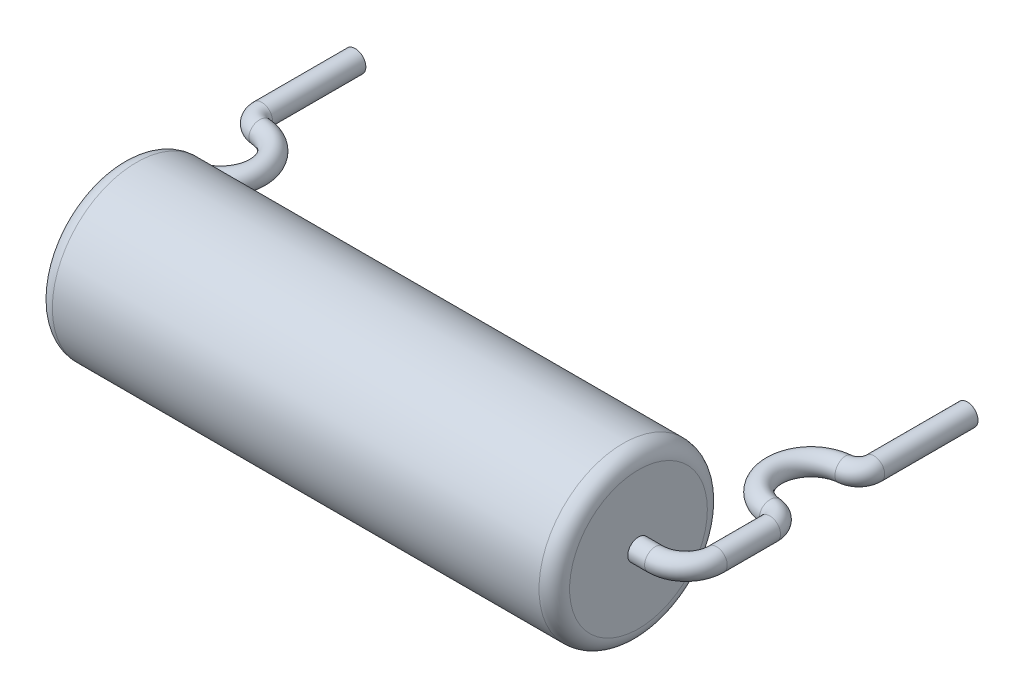
ISO-10303-21;
HEADER;
FILE_DESCRIPTION(('STEP AP214'),'2;1');
FILE_NAME('part.step','',(''),(''),'','','');
FILE_SCHEMA(('AUTOMOTIVE_DESIGN { 1 0 10303 214 1 1 1 1 }'));
ENDSEC;
DATA;
#1=APPLICATION_CONTEXT('core data for automotive mechanical design processes');
#2=APPLICATION_PROTOCOL_DEFINITION('international standard','automotive_design',2000,#1);
#3=PRODUCT_CONTEXT('',#1,'mechanical');
#4=PRODUCT('Part','Part','',(#3));
#5=PRODUCT_RELATED_PRODUCT_CATEGORY('part','',(#4));
#6=PRODUCT_DEFINITION_FORMATION('','',#4);
#7=PRODUCT_DEFINITION_CONTEXT('part definition',#1,'design');
#8=PRODUCT_DEFINITION('design','',#6,#7);
#9=PRODUCT_DEFINITION_SHAPE('','',#8);
#10=(LENGTH_UNIT() NAMED_UNIT(*) SI_UNIT(.MILLI.,.METRE.));
#11=(NAMED_UNIT(*) PLANE_ANGLE_UNIT() SI_UNIT($,.RADIAN.));
#12=(NAMED_UNIT(*) SI_UNIT($,.STERADIAN.) SOLID_ANGLE_UNIT());
#13=UNCERTAINTY_MEASURE_WITH_UNIT(LENGTH_MEASURE(1.E-05),#10,'distance_accuracy_value','');
#14=(GEOMETRIC_REPRESENTATION_CONTEXT(3) GLOBAL_UNCERTAINTY_ASSIGNED_CONTEXT((#13)) GLOBAL_UNIT_ASSIGNED_CONTEXT((#10,
#11,#12)) REPRESENTATION_CONTEXT('',''));
#15=CARTESIAN_POINT('',(0.,0.,0.));
#16=DIRECTION('',(0.,0.,1.));
#17=DIRECTION('',(1.,0.,0.));
#18=AXIS2_PLACEMENT_3D('',#15,#16,#17);
#19=CARTESIAN_POINT('',(55.4043058474384,17.8562,0.710478700154001));
#20=DIRECTION('',(0.,1.,0.));
#21=DIRECTION('',(0.,0.,1.));
#22=AXIS2_PLACEMENT_3D('',#19,#20,#21);
#23=TOROIDAL_SURFACE('',#22,0.635,0.4445);
#24=CARTESIAN_POINT('',(54.7693058474384,17.8562,0.710478700154001));
#25=DIRECTION('',(0.,0.,-1.));
#26=DIRECTION('',(-1.,0.,0.));
#27=AXIS2_PLACEMENT_3D('',#24,#25,#26);
#28=CIRCLE('',#27,0.4445);
#29=CARTESIAN_POINT('',(55.2138058474384,17.8562,0.710478700154001));
#30=VERTEX_POINT('',#29);
#31=EDGE_CURVE('E37',#30,#30,#28,.T.);
#32=ORIENTED_EDGE('',*,*,#31,.F.);
#33=EDGE_LOOP('',(#32));
#34=FACE_BOUND('',#33,.T.);
#35=CARTESIAN_POINT('',(55.3501691719874,17.8562,1.343166791058));
#36=DIRECTION('',(-0.996359198273232,0.,-0.08525460700937));
#37=DIRECTION('',(-0.08525460700937,0.,0.996359198273232));
#38=AXIS2_PLACEMENT_3D('',#35,#36,#37);
#39=CIRCLE('',#38,0.4445);
#40=CARTESIAN_POINT('',(55.3880648448031,17.8562,0.900285127425225));
#41=VERTEX_POINT('',#40);
#42=EDGE_CURVE('E11',#41,#41,#39,.T.);
#43=ORIENTED_EDGE('',*,*,#42,.T.);
#44=EDGE_LOOP('',(#43));
#45=FACE_BOUND('',#44,.T.);
#46=ADVANCED_FACE('F16',(#34,#45),#23,.T.);
#47=CARTESIAN_POINT('',(55.2195068402254,17.8562,2.8702));
#48=DIRECTION('',(0.,-1.,0.));
#49=DIRECTION('',(0.,0.,-1.));
#50=AXIS2_PLACEMENT_3D('',#47,#48,#49);
#51=TOROIDAL_SURFACE('',#50,1.532613149544,0.4445);
#52=ORIENTED_EDGE('',*,*,#42,.F.);
#53=EDGE_LOOP('',(#52));
#54=FACE_BOUND('',#53,.T.);
#55=CARTESIAN_POINT('',(55.3501691719874,17.8562,4.397233208942));
#56=DIRECTION('',(0.996359198273232,0.,-0.08525460700937));
#57=DIRECTION('',(-0.08525460700937,0.,-0.996359198273232));
#58=AXIS2_PLACEMENT_3D('',#55,#56,#57);
#59=CIRCLE('',#58,0.4445);
#60=CARTESIAN_POINT('',(55.3122734991718,17.8562,3.9543515453098));
#61=VERTEX_POINT('',#60);
#62=EDGE_CURVE('E26',#61,#61,#59,.T.);
#63=ORIENTED_EDGE('',*,*,#62,.T.);
#64=EDGE_LOOP('',(#63));
#65=FACE_BOUND('',#64,.T.);
#66=ADVANCED_FACE('F205',(#54,#65),#51,.T.);
#67=CARTESIAN_POINT('',(55.4043058474384,17.8562,5.029921299846));
#68=DIRECTION('',(0.,1.,0.));
#69=DIRECTION('',(0.,0.,1.));
#70=AXIS2_PLACEMENT_3D('',#67,#68,#69);
#71=TOROIDAL_SURFACE('',#70,0.635,0.4445);
#72=ORIENTED_EDGE('',*,*,#62,.F.);
#73=EDGE_LOOP('',(#72));
#74=FACE_BOUND('',#73,.T.);
#75=CARTESIAN_POINT('',(54.7693058474384,17.8562,5.029921299846));
#76=DIRECTION('',(0.,0.,-1.));
#77=DIRECTION('',(-1.,0.,0.));
#78=AXIS2_PLACEMENT_3D('',#75,#76,#77);
#79=CIRCLE('',#78,0.4445);
#80=CARTESIAN_POINT('',(55.2138058474384,17.8562,5.029921299846));
#81=VERTEX_POINT('',#80);
#82=EDGE_CURVE('E132',#81,#81,#79,.T.);
#83=ORIENTED_EDGE('',*,*,#82,.T.);
#84=EDGE_LOOP('',(#83));
#85=FACE_BOUND('',#84,.T.);
#86=ADVANCED_FACE('F210',(#74,#85),#71,.T.);
#87=CARTESIAN_POINT('',(56.0393058474384,17.8562,7.2427));
#88=DIRECTION('',(0.,1.,0.));
#89=DIRECTION('',(0.,0.,1.));
#90=AXIS2_PLACEMENT_3D('',#87,#88,#89);
#91=TOROIDAL_SURFACE('',#90,1.27,0.4445);
#92=CARTESIAN_POINT('',(54.7693058474384,17.8562,7.2427));
#93=DIRECTION('',(0.,0.,-1.));
#94=DIRECTION('',(-1.,0.,0.));
#95=AXIS2_PLACEMENT_3D('',#92,#93,#94);
#96=CIRCLE('',#95,0.4445);
#97=CARTESIAN_POINT('',(55.2138058474384,17.8562,7.2427));
#98=VERTEX_POINT('',#97);
#99=EDGE_CURVE('E123',#98,#98,#96,.T.);
#100=ORIENTED_EDGE('',*,*,#99,.F.);
#101=EDGE_LOOP('',(#100));
#102=FACE_BOUND('',#101,.T.);
#103=CARTESIAN_POINT('',(56.0393058474384,17.8562,8.5127));
#104=DIRECTION('',(-1.,0.,0.));
#105=DIRECTION('',(0.,0.,1.));
#106=AXIS2_PLACEMENT_3D('',#103,#104,#105);
#107=CIRCLE('',#106,0.4445);
#108=CARTESIAN_POINT('',(56.0393058474384,17.8562,8.0682));
#109=VERTEX_POINT('',#108);
#110=EDGE_CURVE('E136',#109,#109,#107,.T.);
#111=ORIENTED_EDGE('',*,*,#110,.T.);
#112=EDGE_LOOP('',(#111));
#113=FACE_BOUND('',#112,.T.);
#114=ADVANCED_FACE('F251',(#102,#113),#91,.T.);
#115=CARTESIAN_POINT('',(78.8993058474384,17.8562,7.2427));
#116=DIRECTION('',(0.,1.,0.));
#117=DIRECTION('',(0.,0.,1.));
#118=AXIS2_PLACEMENT_3D('',#115,#116,#117);
#119=TOROIDAL_SURFACE('',#118,1.27,0.4445);
#120=CARTESIAN_POINT('',(78.8993058474384,17.8562,8.5127));
#121=DIRECTION('',(-1.,0.,0.));
#122=DIRECTION('',(0.,0.,1.));
#123=AXIS2_PLACEMENT_3D('',#120,#121,#122);
#124=CIRCLE('',#123,0.4445);
#125=CARTESIAN_POINT('',(78.8993058474384,17.8562,8.0682));
#126=VERTEX_POINT('',#125);
#127=EDGE_CURVE('E128',#126,#126,#124,.T.);
#128=ORIENTED_EDGE('',*,*,#127,.F.);
#129=EDGE_LOOP('',(#128));
#130=FACE_BOUND('',#129,.T.);
#131=CARTESIAN_POINT('',(80.1693058474384,17.8562,7.2427));
#132=DIRECTION('',(0.,0.,1.));
#133=DIRECTION('',(1.,0.,0.));
#134=AXIS2_PLACEMENT_3D('',#131,#132,#133);
#135=CIRCLE('',#134,0.4445);
#136=CARTESIAN_POINT('',(79.7248058474384,17.8562,7.2427));
#137=VERTEX_POINT('',#136);
#138=EDGE_CURVE('E146',#137,#137,#135,.T.);
#139=ORIENTED_EDGE('',*,*,#138,.T.);
#140=EDGE_LOOP('',(#139));
#141=FACE_BOUND('',#140,.T.);
#142=ADVANCED_FACE('F187',(#130,#141),#119,.T.);
#143=CARTESIAN_POINT('',(79.5343058474384,17.8562,5.029921299846));
#144=DIRECTION('',(0.,1.,0.));
#145=DIRECTION('',(0.,0.,1.));
#146=AXIS2_PLACEMENT_3D('',#143,#144,#145);
#147=TOROIDAL_SURFACE('',#146,0.635,0.4445);
#148=CARTESIAN_POINT('',(80.1693058474384,17.8562,5.029921299846));
#149=DIRECTION('',(0.,0.,1.));
#150=DIRECTION('',(1.,0.,0.));
#151=AXIS2_PLACEMENT_3D('',#148,#149,#150);
#152=CIRCLE('',#151,0.4445);
#153=CARTESIAN_POINT('',(79.7248058474384,17.8562,5.029921299846));
#154=VERTEX_POINT('',#153);
#155=EDGE_CURVE('E157',#154,#154,#152,.T.);
#156=ORIENTED_EDGE('',*,*,#155,.F.);
#157=EDGE_LOOP('',(#156));
#158=FACE_BOUND('',#157,.T.);
#159=CARTESIAN_POINT('',(79.5884425228894,17.8562,4.397233208942));
#160=DIRECTION('',(0.996359198273233,0.,0.0852546070093598));
#161=DIRECTION('',(0.0852546070093598,0.,-0.996359198273233));
#162=AXIS2_PLACEMENT_3D('',#159,#160,#161);
#163=CIRCLE('',#162,0.4445);
#164=CARTESIAN_POINT('',(79.5505468500737,17.8562,4.84011487257478));
#165=VERTEX_POINT('',#164);
#166=EDGE_CURVE('E158',#165,#165,#163,.T.);
#167=ORIENTED_EDGE('',*,*,#166,.T.);
#168=EDGE_LOOP('',(#167));
#169=FACE_BOUND('',#168,.T.);
#170=ADVANCED_FACE('F255',(#158,#169),#147,.T.);
#171=CARTESIAN_POINT('',(79.7191048546514,17.8562,2.8702));
#172=DIRECTION('',(0.,-1.,0.));
#173=DIRECTION('',(0.,0.,-1.));
#174=AXIS2_PLACEMENT_3D('',#171,#172,#173);
#175=TOROIDAL_SURFACE('',#174,1.532613149544,0.4445);
#176=ORIENTED_EDGE('',*,*,#166,.F.);
#177=EDGE_LOOP('',(#176));
#178=FACE_BOUND('',#177,.T.);
#179=CARTESIAN_POINT('',(79.5884425228894,17.8562,1.343166791058));
#180=DIRECTION('',(-0.996359198273233,0.,0.0852546070093598));
#181=DIRECTION('',(0.0852546070093598,0.,0.996359198273233));
#182=AXIS2_PLACEMENT_3D('',#179,#180,#181);
#183=CIRCLE('',#182,0.4445);
#184=CARTESIAN_POINT('',(79.6263381957051,17.8562,1.78604845469021));
#185=VERTEX_POINT('',#184);
#186=EDGE_CURVE('E141',#185,#185,#183,.T.);
#187=ORIENTED_EDGE('',*,*,#186,.T.);
#188=EDGE_LOOP('',(#187));
#189=FACE_BOUND('',#188,.T.);
#190=ADVANCED_FACE('F259',(#178,#189),#175,.T.);
#191=CARTESIAN_POINT('',(79.5343058474384,17.8562,0.710478700154001));
#192=DIRECTION('',(0.,1.,0.));
#193=DIRECTION('',(0.,0.,1.));
#194=AXIS2_PLACEMENT_3D('',#191,#192,#193);
#195=TOROIDAL_SURFACE('',#194,0.635,0.4445);
#196=ORIENTED_EDGE('',*,*,#186,.F.);
#197=EDGE_LOOP('',(#196));
#198=FACE_BOUND('',#197,.T.);
#199=CARTESIAN_POINT('',(80.1693058474384,17.8562,0.710478700154001));
#200=DIRECTION('',(0.,0.,1.));
#201=DIRECTION('',(1.,0.,0.));
#202=AXIS2_PLACEMENT_3D('',#199,#200,#201);
#203=CIRCLE('',#202,0.4445);
#204=CARTESIAN_POINT('',(79.7248058474384,17.8562,0.710478700154001));
#205=VERTEX_POINT('',#204);
#206=EDGE_CURVE('E137',#205,#205,#203,.T.);
#207=ORIENTED_EDGE('',*,*,#206,.T.);
#208=EDGE_LOOP('',(#207));
#209=FACE_BOUND('',#208,.T.);
#210=ADVANCED_FACE('F228',(#198,#209),#195,.T.);
#211=CARTESIAN_POINT('',(80.1693058474384,17.8562,0.0127000000000011));
#212=DIRECTION('',(0.,0.,-1.));
#213=DIRECTION('',(-1.,0.,0.));
#214=AXIS2_PLACEMENT_3D('',#211,#212,#213);
#215=CYLINDRICAL_SURFACE('',#214,0.4445);
#216=ORIENTED_EDGE('',*,*,#206,.F.);
#217=EDGE_LOOP('',(#216));
#218=FACE_BOUND('',#217,.T.);
#219=CARTESIAN_POINT('',(80.1693058474384,17.8562,-3.1623));
#220=DIRECTION('',(0.,0.,1.));
#221=DIRECTION('',(-1.,0.,0.));
#222=AXIS2_PLACEMENT_3D('',#219,#220,#221);
#223=CIRCLE('',#222,0.4445);
#224=CARTESIAN_POINT('',(79.7248058474384,17.8562,-3.1623));
#225=VERTEX_POINT('',#224);
#226=EDGE_CURVE('E142',#225,#225,#223,.T.);
#227=ORIENTED_EDGE('',*,*,#226,.T.);
#228=EDGE_LOOP('',(#227));
#229=FACE_BOUND('',#228,.T.);
#230=ADVANCED_FACE('F221',(#218,#229),#215,.T.);
#231=CARTESIAN_POINT('',(54.7693058474384,17.8562,0.0127000000000011));
#232=DIRECTION('',(0.,0.,-1.));
#233=DIRECTION('',(-1.,0.,0.));
#234=AXIS2_PLACEMENT_3D('',#231,#232,#233);
#235=CYLINDRICAL_SURFACE('',#234,0.4445);
#236=ORIENTED_EDGE('',*,*,#31,.T.);
#237=EDGE_LOOP('',(#236));
#238=FACE_BOUND('',#237,.T.);
#239=CARTESIAN_POINT('',(54.7693058474384,17.8562,-3.1623));
#240=DIRECTION('',(0.,0.,1.));
#241=DIRECTION('',(-1.,0.,0.));
#242=AXIS2_PLACEMENT_3D('',#239,#240,#241);
#243=CIRCLE('',#242,0.4445);
#244=CARTESIAN_POINT('',(54.3248058474384,17.8562,-3.1623));
#245=VERTEX_POINT('',#244);
#246=EDGE_CURVE('E153',#245,#245,#243,.T.);
#247=ORIENTED_EDGE('',*,*,#246,.T.);
#248=EDGE_LOOP('',(#247));
#249=FACE_BOUND('',#248,.T.);
#250=ADVANCED_FACE('F219',(#238,#249),#235,.T.);
#251=CARTESIAN_POINT('',(54.7693058474384,17.8562,5.029921299846));
#252=DIRECTION('',(0.,0.,1.));
#253=DIRECTION('',(-1.,0.,0.));
#254=AXIS2_PLACEMENT_3D('',#251,#252,#253);
#255=CYLINDRICAL_SURFACE('',#254,0.4445);
#256=ORIENTED_EDGE('',*,*,#82,.F.);
#257=EDGE_LOOP('',(#256));
#258=FACE_BOUND('',#257,.T.);
#259=ORIENTED_EDGE('',*,*,#99,.T.);
#260=EDGE_LOOP('',(#259));
#261=FACE_BOUND('',#260,.T.);
#262=ADVANCED_FACE('F199',(#258,#261),#255,.T.);
#263=CARTESIAN_POINT('',(56.0393058474384,17.8562,8.5127));
#264=DIRECTION('',(1.,0.,0.));
#265=DIRECTION('',(0.,0.,1.));
#266=AXIS2_PLACEMENT_3D('',#263,#264,#265);
#267=CYLINDRICAL_SURFACE('',#266,0.4445);
#268=CARTESIAN_POINT('',(78.2008058474384,17.8562,8.5127));
#269=DIRECTION('',(1.,0.,0.));
#270=DIRECTION('',(0.,0.,1.));
#271=AXIS2_PLACEMENT_3D('',#268,#269,#270);
#272=CIRCLE('',#271,0.4445);
#273=CARTESIAN_POINT('',(78.2008058474384,17.8562,8.0682));
#274=VERTEX_POINT('',#273);
#275=EDGE_CURVE('E124',#274,#274,#272,.T.);
#276=ORIENTED_EDGE('',*,*,#275,.T.);
#277=EDGE_LOOP('',(#276));
#278=FACE_BOUND('',#277,.T.);
#279=ORIENTED_EDGE('',*,*,#127,.T.);
#280=EDGE_LOOP('',(#279));
#281=FACE_BOUND('',#280,.T.);
#282=ADVANCED_FACE('F191',(#278,#281),#267,.T.);
#283=CARTESIAN_POINT('',(80.1693058474384,17.8562,7.2427));
#284=DIRECTION('',(0.,0.,-1.));
#285=DIRECTION('',(1.,0.,0.));
#286=AXIS2_PLACEMENT_3D('',#283,#284,#285);
#287=CYLINDRICAL_SURFACE('',#286,0.4445);
#288=ORIENTED_EDGE('',*,*,#138,.F.);
#289=EDGE_LOOP('',(#288));
#290=FACE_BOUND('',#289,.T.);
#291=ORIENTED_EDGE('',*,*,#155,.T.);
#292=EDGE_LOOP('',(#291));
#293=FACE_BOUND('',#292,.T.);
#294=ADVANCED_FACE('F189',(#290,#293),#287,.T.);
#295=CARTESIAN_POINT('',(56.0393058474384,17.8562,8.5127));
#296=DIRECTION('',(1.,0.,0.));
#297=DIRECTION('',(0.,0.,1.));
#298=AXIS2_PLACEMENT_3D('',#295,#296,#297);
#299=CYLINDRICAL_SURFACE('',#298,0.4445);
#300=ORIENTED_EDGE('',*,*,#110,.F.);
#301=EDGE_LOOP('',(#300));
#302=FACE_BOUND('',#301,.T.);
#303=CARTESIAN_POINT('',(56.7378058474384,17.8562,8.5127));
#304=DIRECTION('',(-1.,0.,0.));
#305=DIRECTION('',(0.,0.,1.));
#306=AXIS2_PLACEMENT_3D('',#303,#304,#305);
#307=CIRCLE('',#306,0.4445);
#308=CARTESIAN_POINT('',(56.7378058474384,17.8562,8.9572));
#309=VERTEX_POINT('',#308);
#310=EDGE_CURVE('E150',#309,#309,#307,.T.);
#311=ORIENTED_EDGE('',*,*,#310,.T.);
#312=EDGE_LOOP('',(#311));
#313=FACE_BOUND('',#312,.T.);
#314=ADVANCED_FACE('F18',(#302,#313),#299,.T.);
#315=CARTESIAN_POINT('',(57.3728058474384,17.8562,8.5127));
#316=DIRECTION('',(-1.,0.,0.));
#317=DIRECTION('',(0.,0.,1.));
#318=AXIS2_PLACEMENT_3D('',#315,#316,#317);
#319=TOROIDAL_SURFACE('',#318,2.8575,0.635);
#320=CARTESIAN_POINT('',(57.3728058474384,17.8562,8.5127));
#321=DIRECTION('',(-1.,0.,0.));
#322=DIRECTION('',(0.,0.,1.));
#323=AXIS2_PLACEMENT_3D('',#320,#321,#322);
#324=CIRCLE('',#323,3.4925);
#325=CARTESIAN_POINT('',(57.3728058474384,17.8562,5.0202));
#326=VERTEX_POINT('',#325);
#327=EDGE_CURVE('E117',#326,#326,#324,.T.);
#328=ORIENTED_EDGE('',*,*,#327,.T.);
#329=EDGE_LOOP('',(#328));
#330=FACE_BOUND('',#329,.T.);
#331=CARTESIAN_POINT('',(56.7378058474384,17.8562,8.5127));
#332=DIRECTION('',(-1.,0.,0.));
#333=DIRECTION('',(0.,0.,1.));
#334=AXIS2_PLACEMENT_3D('',#331,#332,#333);
#335=CIRCLE('',#334,2.8575);
#336=CARTESIAN_POINT('',(56.7378058474384,17.8562,11.3702));
#337=VERTEX_POINT('',#336);
#338=EDGE_CURVE('E110',#337,#337,#335,.T.);
#339=ORIENTED_EDGE('',*,*,#338,.F.);
#340=EDGE_LOOP('',(#339));
#341=FACE_BOUND('',#340,.T.);
#342=ADVANCED_FACE('F197',(#330,#341),#319,.T.);
#343=CARTESIAN_POINT('',(67.4693058474384,17.8562,8.5127));
#344=DIRECTION('',(-1.,0.,0.));
#345=DIRECTION('',(0.,0.,1.));
#346=AXIS2_PLACEMENT_3D('',#343,#344,#345);
#347=CYLINDRICAL_SURFACE('',#346,3.4925);
#348=CARTESIAN_POINT('',(77.5658058474384,17.8562,8.5127));
#349=DIRECTION('',(-1.,0.,0.));
#350=DIRECTION('',(0.,0.,1.));
#351=AXIS2_PLACEMENT_3D('',#348,#349,#350);
#352=CIRCLE('',#351,3.4925);
#353=CARTESIAN_POINT('',(77.5658058474384,17.8562,5.0202));
#354=VERTEX_POINT('',#353);
#355=EDGE_CURVE('E98',#354,#354,#352,.T.);
#356=ORIENTED_EDGE('',*,*,#355,.T.);
#357=EDGE_LOOP('',(#356));
#358=FACE_BOUND('',#357,.T.);
#359=ORIENTED_EDGE('',*,*,#327,.F.);
#360=EDGE_LOOP('',(#359));
#361=FACE_BOUND('',#360,.T.);
#362=ADVANCED_FACE('F263',(#358,#361),#347,.T.);
#363=CARTESIAN_POINT('',(77.5658058474384,17.8562,8.5127));
#364=DIRECTION('',(-1.,0.,0.));
#365=DIRECTION('',(0.,0.,1.));
#366=AXIS2_PLACEMENT_3D('',#363,#364,#365);
#367=TOROIDAL_SURFACE('',#366,2.8575,0.635);
#368=CARTESIAN_POINT('',(78.2008058474384,17.8562,8.5127));
#369=DIRECTION('',(-1.,0.,0.));
#370=DIRECTION('',(0.,0.,1.));
#371=AXIS2_PLACEMENT_3D('',#368,#369,#370);
#372=CIRCLE('',#371,2.8575);
#373=CARTESIAN_POINT('',(78.2008058474384,17.8562,5.6552));
#374=VERTEX_POINT('',#373);
#375=EDGE_CURVE('E105',#374,#374,#372,.T.);
#376=ORIENTED_EDGE('',*,*,#375,.T.);
#377=EDGE_LOOP('',(#376));
#378=FACE_BOUND('',#377,.T.);
#379=ORIENTED_EDGE('',*,*,#355,.F.);
#380=EDGE_LOOP('',(#379));
#381=FACE_BOUND('',#380,.T.);
#382=ADVANCED_FACE('F218',(#378,#381),#367,.T.);
#383=CARTESIAN_POINT('',(78.2008058474384,17.8562,9.94145));
#384=DIRECTION('',(1.,0.,0.));
#385=DIRECTION('',(0.,1.,0.));
#386=AXIS2_PLACEMENT_3D('',#383,#384,#385);
#387=PLANE('',#386);
#388=ORIENTED_EDGE('',*,*,#375,.F.);
#389=EDGE_LOOP('',(#388));
#390=FACE_BOUND('',#389,.T.);
#391=ORIENTED_EDGE('',*,*,#275,.F.);
#392=EDGE_LOOP('',(#391));
#393=FACE_BOUND('',#392,.T.);
#394=ADVANCED_FACE('F106',(#390,#393),#387,.T.);
#395=CARTESIAN_POINT('',(56.7378058474384,17.8562,9.94145));
#396=DIRECTION('',(-1.,0.,0.));
#397=DIRECTION('',(0.,0.,1.));
#398=AXIS2_PLACEMENT_3D('',#395,#396,#397);
#399=PLANE('',#398);
#400=ORIENTED_EDGE('',*,*,#338,.T.);
#401=EDGE_LOOP('',(#400));
#402=FACE_BOUND('',#401,.T.);
#403=ORIENTED_EDGE('',*,*,#310,.F.);
#404=EDGE_LOOP('',(#403));
#405=FACE_BOUND('',#404,.T.);
#406=ADVANCED_FACE('F217',(#402,#405),#399,.T.);
#407=CARTESIAN_POINT('',(54.7693058474384,17.8562,-3.1623));
#408=DIRECTION('',(0.,0.,-1.));
#409=DIRECTION('',(0.,-1.,0.));
#410=AXIS2_PLACEMENT_3D('',#407,#408,#409);
#411=PLANE('',#410);
#412=ORIENTED_EDGE('',*,*,#246,.F.);
#413=EDGE_LOOP('',(#412));
#414=FACE_BOUND('',#413,.T.);
#415=ADVANCED_FACE('F236',(#414),#411,.T.);
#416=CARTESIAN_POINT('',(80.1693058474384,17.8562,-3.1623));
#417=DIRECTION('',(0.,0.,-1.));
#418=DIRECTION('',(0.,-1.,0.));
#419=AXIS2_PLACEMENT_3D('',#416,#417,#418);
#420=PLANE('',#419);
#421=ORIENTED_EDGE('',*,*,#226,.F.);
#422=EDGE_LOOP('',(#421));
#423=FACE_BOUND('',#422,.T.);
#424=ADVANCED_FACE('F238',(#423),#420,.T.);
#425=CLOSED_SHELL('',(#46,#66,#86,#114,#142,#170,#190,#210,#230,#250,#262,#282,#294,#314,#342,
#362,#382,#394,#406,#415,#424));
#426=MANIFOLD_SOLID_BREP('B1',#425);
#427=ADVANCED_BREP_SHAPE_REPRESENTATION('',(#18,#426),#14);
#428=SHAPE_DEFINITION_REPRESENTATION(#9,#427);
ENDSEC;
END-ISO-10303-21;
